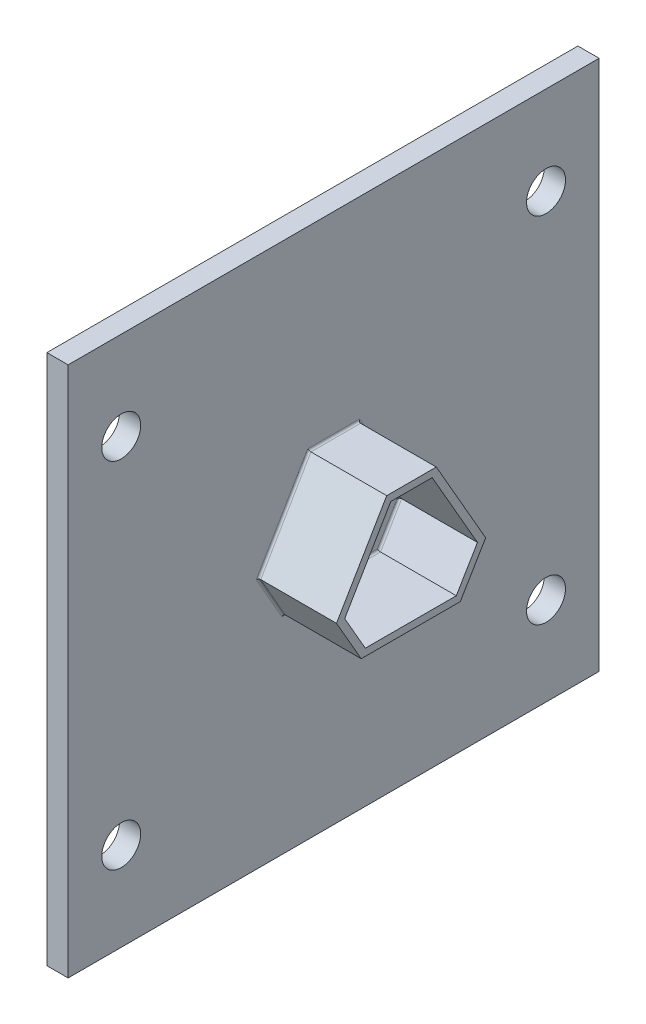
ISO-10303-21;
HEADER;
FILE_DESCRIPTION(('STEP AP214'),'2;1');
FILE_NAME('part.step','',(''),(''),'','','');
FILE_SCHEMA(('AUTOMOTIVE_DESIGN { 1 0 10303 214 1 1 1 1 }'));
ENDSEC;
DATA;
#1=APPLICATION_CONTEXT('core data for automotive mechanical design processes');
#2=APPLICATION_PROTOCOL_DEFINITION('international standard','automotive_design',2000,#1);
#3=PRODUCT_CONTEXT('',#1,'mechanical');
#4=PRODUCT('Part','Part','',(#3));
#5=PRODUCT_RELATED_PRODUCT_CATEGORY('part','',(#4));
#6=PRODUCT_DEFINITION_FORMATION('','',#4);
#7=PRODUCT_DEFINITION_CONTEXT('part definition',#1,'design');
#8=PRODUCT_DEFINITION('design','',#6,#7);
#9=PRODUCT_DEFINITION_SHAPE('','',#8);
#10=(LENGTH_UNIT() NAMED_UNIT(*) SI_UNIT(.MILLI.,.METRE.));
#11=(NAMED_UNIT(*) PLANE_ANGLE_UNIT() SI_UNIT($,.RADIAN.));
#12=(NAMED_UNIT(*) SI_UNIT($,.STERADIAN.) SOLID_ANGLE_UNIT());
#13=UNCERTAINTY_MEASURE_WITH_UNIT(LENGTH_MEASURE(1.E-05),#10,'distance_accuracy_value','');
#14=(GEOMETRIC_REPRESENTATION_CONTEXT(3) GLOBAL_UNCERTAINTY_ASSIGNED_CONTEXT((#13)) GLOBAL_UNIT_ASSIGNED_CONTEXT((#10,
#11,#12)) REPRESENTATION_CONTEXT('',''));
#15=CARTESIAN_POINT('',(0.,0.,0.));
#16=DIRECTION('',(0.,0.,1.));
#17=DIRECTION('',(1.,0.,0.));
#18=AXIS2_PLACEMENT_3D('',#15,#16,#17);
#19=CARTESIAN_POINT('',(3.,0.,0.));
#20=DIRECTION('',(-1.,0.,0.));
#21=DIRECTION('',(0.,0.,1.));
#22=AXIS2_PLACEMENT_3D('',#19,#20,#21);
#23=PLANE('',#22);
#24=DIRECTION('',(0.,-0.00110312181981051,-0.99999939156094));
#25=VECTOR('',#24,1.);
#26=CARTESIAN_POINT('',(3.,136.558370071945,-42.8955674890365));
#27=LINE('',#26,#25);
#28=CARTESIAN_POINT('',(3.,136.542737859647,-57.0664437287992));
#29=VERTEX_POINT('',#28);
#30=CARTESIAN_POINT('',(3.,136.5585613886,-42.7221355659985));
#31=VERTEX_POINT('',#30);
#32=EDGE_CURVE('E322',#29,#31,#27,.F.);
#33=ORIENTED_EDGE('',*,*,#32,.T.);
#34=DIRECTION('',(0.,-0.867141979713052,-0.498061027404604));
#35=VECTOR('',#34,1.);
#36=CARTESIAN_POINT('',(3.,142.778945439183,-39.1493286398363));
#37=LINE('',#36,#35);
#38=CARTESIAN_POINT('',(3.,142.930049924226,-39.0625386367843));
#39=VERTEX_POINT('',#38);
#40=EDGE_CURVE('E332',#31,#39,#37,.F.);
#41=ORIENTED_EDGE('',*,*,#40,.T.);
#42=DIRECTION('',(0.,-0.862259732328274,0.506466340446405));
#43=VECTOR('',#42,1.);
#44=CARTESIAN_POINT('',(3.,155.151939902134,-46.2413220803015));
#45=LINE('',#44,#43);
#46=CARTESIAN_POINT('',(3.,155.3,-46.3282882844751));
#47=VERTEX_POINT('',#46);
#48=EDGE_CURVE('E330',#39,#47,#45,.F.);
#49=ORIENTED_EDGE('',*,*,#48,.T.);
#50=DIRECTION('',(0.,0.,1.));
#51=VECTOR('',#50,1.);
#52=CARTESIAN_POINT('',(3.,155.3,-53.4999999999999));
#53=LINE('',#52,#51);
#54=CARTESIAN_POINT('',(3.,155.3,-53.6736528680441));
#55=VERTEX_POINT('',#54);
#56=EDGE_CURVE('E328',#47,#55,#53,.F.);
#57=ORIENTED_EDGE('',*,*,#56,.T.);
#58=DIRECTION('',(0.,0.867141979713052,0.498061027404604));
#59=VECTOR('',#58,1.);
#60=CARTESIAN_POINT('',(3.,143.009430592239,-60.7329969775783));
#61=LINE('',#60,#59);
#62=CARTESIAN_POINT('',(3.,142.857409670996,-60.8203133548181));
#63=VERTEX_POINT('',#62);
#64=EDGE_CURVE('E326',#55,#63,#61,.F.);
#65=ORIENTED_EDGE('',*,*,#64,.T.);
#66=DIRECTION('',(0.,0.859583728583114,-0.510994925175536));
#67=VECTOR('',#66,1.);
#68=CARTESIAN_POINT('',(3.,136.689627706383,-57.1537650260106));
#69=LINE('',#68,#67);
#70=EDGE_CURVE('E324',#63,#29,#69,.F.);
#71=ORIENTED_EDGE('',*,*,#70,.T.);
#72=EDGE_LOOP('',(#33,#41,#49,#57,#65,#71));
#73=FACE_BOUND('',#72,.T.);
#74=CARTESIAN_POINT('',(3.,120.,-19.9999999999999));
#75=DIRECTION('',(1.,0.,0.));
#76=DIRECTION('',(0.,0.,-1.));
#77=AXIS2_PLACEMENT_3D('',#74,#75,#76);
#78=CIRCLE('',#77,2.75);
#79=CARTESIAN_POINT('',(3.,120.,-22.7499999999999));
#80=VERTEX_POINT('',#79);
#81=EDGE_CURVE('E263',#80,#80,#78,.T.);
#82=ORIENTED_EDGE('',*,*,#81,.F.);
#83=EDGE_LOOP('',(#82));
#84=FACE_BOUND('',#83,.T.);
#85=CARTESIAN_POINT('',(3.,120.,-80.));
#86=DIRECTION('',(1.,0.,0.));
#87=DIRECTION('',(0.,0.,-1.));
#88=AXIS2_PLACEMENT_3D('',#85,#86,#87);
#89=CIRCLE('',#88,2.75000000000001);
#90=CARTESIAN_POINT('',(3.,120.,-82.75));
#91=VERTEX_POINT('',#90);
#92=EDGE_CURVE('E269',#91,#91,#89,.T.);
#93=ORIENTED_EDGE('',*,*,#92,.F.);
#94=EDGE_LOOP('',(#93));
#95=FACE_BOUND('',#94,.T.);
#96=CARTESIAN_POINT('',(3.,170.,-80.));
#97=DIRECTION('',(1.,0.,0.));
#98=DIRECTION('',(0.,0.,-1.));
#99=AXIS2_PLACEMENT_3D('',#96,#97,#98);
#100=CIRCLE('',#99,2.75);
#101=CARTESIAN_POINT('',(3.,170.,-82.75));
#102=VERTEX_POINT('',#101);
#103=EDGE_CURVE('E275',#102,#102,#100,.T.);
#104=ORIENTED_EDGE('',*,*,#103,.F.);
#105=EDGE_LOOP('',(#104));
#106=FACE_BOUND('',#105,.T.);
#107=CARTESIAN_POINT('',(3.,170.,-19.9999999999999));
#108=DIRECTION('',(1.,0.,0.));
#109=DIRECTION('',(0.,0.,-1.));
#110=AXIS2_PLACEMENT_3D('',#107,#108,#109);
#111=CIRCLE('',#110,2.75000000000001);
#112=CARTESIAN_POINT('',(3.,170.,-22.75));
#113=VERTEX_POINT('',#112);
#114=EDGE_CURVE('E281',#113,#113,#111,.T.);
#115=ORIENTED_EDGE('',*,*,#114,.F.);
#116=EDGE_LOOP('',(#115));
#117=FACE_BOUND('',#116,.T.);
#118=DIRECTION('',(0.,1.,0.));
#119=VECTOR('',#118,1.);
#120=CARTESIAN_POINT('',(3.,107.5,-87.4999999999999));
#121=LINE('',#120,#119);
#122=CARTESIAN_POINT('',(3.,107.5,-87.4999999999999));
#123=VERTEX_POINT('',#122);
#124=CARTESIAN_POINT('',(3.,182.5,-87.4999999999999));
#125=VERTEX_POINT('',#124);
#126=EDGE_CURVE('E290',#123,#125,#121,.T.);
#127=ORIENTED_EDGE('',*,*,#126,.T.);
#128=DIRECTION('',(0.,0.,1.));
#129=VECTOR('',#128,1.);
#130=CARTESIAN_POINT('',(3.,182.5,-12.4999999999999));
#131=LINE('',#130,#129);
#132=CARTESIAN_POINT('',(3.,182.5,-12.4999999999999));
#133=VERTEX_POINT('',#132);
#134=EDGE_CURVE('E293',#125,#133,#131,.T.);
#135=ORIENTED_EDGE('',*,*,#134,.T.);
#136=DIRECTION('',(0.,-1.,0.));
#137=VECTOR('',#136,1.);
#138=CARTESIAN_POINT('',(3.,107.5,-12.4999999999999));
#139=LINE('',#138,#137);
#140=CARTESIAN_POINT('',(3.,107.5,-12.4999999999999));
#141=VERTEX_POINT('',#140);
#142=EDGE_CURVE('E296',#133,#141,#139,.T.);
#143=ORIENTED_EDGE('',*,*,#142,.T.);
#144=DIRECTION('',(0.,0.,-1.));
#145=VECTOR('',#144,1.);
#146=CARTESIAN_POINT('',(3.,107.5,-12.4999999999999));
#147=LINE('',#146,#145);
#148=EDGE_CURVE('E298',#141,#123,#147,.T.);
#149=ORIENTED_EDGE('',*,*,#148,.T.);
#150=EDGE_LOOP('',(#127,#135,#143,#149));
#151=FACE_BOUND('',#150,.T.);
#152=ADVANCED_FACE('F36',(#73,#84,#95,#106,#117,#151),#23,.F.);
#153=CARTESIAN_POINT('',(0.,0.,0.));
#154=DIRECTION('',(-1.,0.,0.));
#155=DIRECTION('',(0.,0.,1.));
#156=AXIS2_PLACEMENT_3D('',#153,#154,#155);
#157=PLANE('',#156);
#158=CARTESIAN_POINT('',(0.,120.,-80.));
#159=DIRECTION('',(1.,0.,0.));
#160=DIRECTION('',(0.,0.,-1.));
#161=AXIS2_PLACEMENT_3D('',#158,#159,#160);
#162=CIRCLE('',#161,2.75000000000001);
#163=CARTESIAN_POINT('',(0.,120.,-82.75));
#164=VERTEX_POINT('',#163);
#165=EDGE_CURVE('E266',#164,#164,#162,.T.);
#166=ORIENTED_EDGE('',*,*,#165,.T.);
#167=EDGE_LOOP('',(#166));
#168=FACE_BOUND('',#167,.T.);
#169=CARTESIAN_POINT('',(0.,170.,-19.9999999999999));
#170=DIRECTION('',(1.,0.,0.));
#171=DIRECTION('',(0.,0.,-1.));
#172=AXIS2_PLACEMENT_3D('',#169,#170,#171);
#173=CIRCLE('',#172,2.75000000000001);
#174=CARTESIAN_POINT('',(0.,170.,-22.75));
#175=VERTEX_POINT('',#174);
#176=EDGE_CURVE('E278',#175,#175,#173,.T.);
#177=ORIENTED_EDGE('',*,*,#176,.T.);
#178=EDGE_LOOP('',(#177));
#179=FACE_BOUND('',#178,.T.);
#180=DIRECTION('',(0.,1.,0.));
#181=VECTOR('',#180,1.);
#182=CARTESIAN_POINT('',(0.,107.5,-87.4999999999999));
#183=LINE('',#182,#181);
#184=CARTESIAN_POINT('',(0.,107.5,-87.4999999999999));
#185=VERTEX_POINT('',#184);
#186=CARTESIAN_POINT('',(0.,182.5,-87.4999999999999));
#187=VERTEX_POINT('',#186);
#188=EDGE_CURVE('E289',#185,#187,#183,.T.);
#189=ORIENTED_EDGE('',*,*,#188,.F.);
#190=DIRECTION('',(0.,0.,-1.));
#191=VECTOR('',#190,1.);
#192=CARTESIAN_POINT('',(0.,107.5,-12.4999999999999));
#193=LINE('',#192,#191);
#194=CARTESIAN_POINT('',(0.,107.5,-12.4999999999999));
#195=VERTEX_POINT('',#194);
#196=EDGE_CURVE('E294',#195,#185,#193,.T.);
#197=ORIENTED_EDGE('',*,*,#196,.F.);
#198=DIRECTION('',(0.,-1.,0.));
#199=VECTOR('',#198,1.);
#200=CARTESIAN_POINT('',(0.,107.5,-12.4999999999999));
#201=LINE('',#200,#199);
#202=CARTESIAN_POINT('',(0.,182.5,-12.4999999999999));
#203=VERTEX_POINT('',#202);
#204=EDGE_CURVE('E305',#203,#195,#201,.T.);
#205=ORIENTED_EDGE('',*,*,#204,.F.);
#206=DIRECTION('',(0.,0.,1.));
#207=VECTOR('',#206,1.);
#208=CARTESIAN_POINT('',(0.,182.5,-12.4999999999999));
#209=LINE('',#208,#207);
#210=EDGE_CURVE('E303',#187,#203,#209,.T.);
#211=ORIENTED_EDGE('',*,*,#210,.F.);
#212=EDGE_LOOP('',(#189,#197,#205,#211));
#213=FACE_BOUND('',#212,.T.);
#214=CARTESIAN_POINT('',(0.,145.,-50.));
#215=DIRECTION('',(1.,0.,0.));
#216=DIRECTION('',(0.,0.,-1.));
#217=AXIS2_PLACEMENT_3D('',#214,#215,#216);
#218=CIRCLE('',#217,6.5);
#219=CARTESIAN_POINT('',(0.,145.,-56.5));
#220=VERTEX_POINT('',#219);
#221=EDGE_CURVE('E284',#220,#220,#218,.T.);
#222=ORIENTED_EDGE('',*,*,#221,.T.);
#223=EDGE_LOOP('',(#222));
#224=FACE_BOUND('',#223,.T.);
#225=CARTESIAN_POINT('',(0.,170.,-80.));
#226=DIRECTION('',(1.,0.,0.));
#227=DIRECTION('',(0.,0.,-1.));
#228=AXIS2_PLACEMENT_3D('',#225,#226,#227);
#229=CIRCLE('',#228,2.75);
#230=CARTESIAN_POINT('',(0.,170.,-82.75));
#231=VERTEX_POINT('',#230);
#232=EDGE_CURVE('E272',#231,#231,#229,.T.);
#233=ORIENTED_EDGE('',*,*,#232,.T.);
#234=EDGE_LOOP('',(#233));
#235=FACE_BOUND('',#234,.T.);
#236=CARTESIAN_POINT('',(0.,120.,-19.9999999999999));
#237=DIRECTION('',(1.,0.,0.));
#238=DIRECTION('',(0.,0.,-1.));
#239=AXIS2_PLACEMENT_3D('',#236,#237,#238);
#240=CIRCLE('',#239,2.75);
#241=CARTESIAN_POINT('',(0.,120.,-22.7499999999999));
#242=VERTEX_POINT('',#241);
#243=EDGE_CURVE('E260',#242,#242,#240,.T.);
#244=ORIENTED_EDGE('',*,*,#243,.T.);
#245=EDGE_LOOP('',(#244));
#246=FACE_BOUND('',#245,.T.);
#247=ADVANCED_FACE('F427',(#168,#179,#213,#224,#235,#246),#157,.T.);
#248=CARTESIAN_POINT('',(3.,107.5,-87.4999999999999));
#249=DIRECTION('',(0.,0.,1.));
#250=DIRECTION('',(1.,0.,0.));
#251=AXIS2_PLACEMENT_3D('',#248,#249,#250);
#252=PLANE('',#251);
#253=ORIENTED_EDGE('',*,*,#188,.T.);
#254=DIRECTION('',(-1.,0.,0.));
#255=VECTOR('',#254,1.);
#256=CARTESIAN_POINT('',(3.,182.5,-87.4999999999999));
#257=LINE('',#256,#255);
#258=EDGE_CURVE('E316',#125,#187,#257,.T.);
#259=ORIENTED_EDGE('',*,*,#258,.F.);
#260=ORIENTED_EDGE('',*,*,#126,.F.);
#261=DIRECTION('',(-1.,0.,0.));
#262=VECTOR('',#261,1.);
#263=CARTESIAN_POINT('',(3.,107.5,-87.4999999999999));
#264=LINE('',#263,#262);
#265=EDGE_CURVE('E300',#123,#185,#264,.T.);
#266=ORIENTED_EDGE('',*,*,#265,.T.);
#267=EDGE_LOOP('',(#253,#259,#260,#266));
#268=FACE_BOUND('',#267,.T.);
#269=ADVANCED_FACE('F433',(#268),#252,.F.);
#270=CARTESIAN_POINT('',(3.,182.5,-12.4999999999999));
#271=DIRECTION('',(0.,-1.,0.));
#272=DIRECTION('',(0.,0.,-1.));
#273=AXIS2_PLACEMENT_3D('',#270,#271,#272);
#274=PLANE('',#273);
#275=ORIENTED_EDGE('',*,*,#210,.T.);
#276=DIRECTION('',(-1.,0.,0.));
#277=VECTOR('',#276,1.);
#278=CARTESIAN_POINT('',(3.,182.5,-12.4999999999999));
#279=LINE('',#278,#277);
#280=EDGE_CURVE('E313',#133,#203,#279,.T.);
#281=ORIENTED_EDGE('',*,*,#280,.F.);
#282=ORIENTED_EDGE('',*,*,#134,.F.);
#283=ORIENTED_EDGE('',*,*,#258,.T.);
#284=EDGE_LOOP('',(#275,#281,#282,#283));
#285=FACE_BOUND('',#284,.T.);
#286=ADVANCED_FACE('F448',(#285),#274,.F.);
#287=CARTESIAN_POINT('',(3.,107.5,-12.4999999999999));
#288=DIRECTION('',(0.,0.,-1.));
#289=DIRECTION('',(-1.,0.,0.));
#290=AXIS2_PLACEMENT_3D('',#287,#288,#289);
#291=PLANE('',#290);
#292=ORIENTED_EDGE('',*,*,#204,.T.);
#293=DIRECTION('',(-1.,0.,0.));
#294=VECTOR('',#293,1.);
#295=CARTESIAN_POINT('',(3.,107.5,-12.4999999999999));
#296=LINE('',#295,#294);
#297=EDGE_CURVE('E310',#141,#195,#296,.T.);
#298=ORIENTED_EDGE('',*,*,#297,.F.);
#299=ORIENTED_EDGE('',*,*,#142,.F.);
#300=ORIENTED_EDGE('',*,*,#280,.T.);
#301=EDGE_LOOP('',(#292,#298,#299,#300));
#302=FACE_BOUND('',#301,.T.);
#303=ADVANCED_FACE('F444',(#302),#291,.F.);
#304=CARTESIAN_POINT('',(3.,107.5,-12.4999999999999));
#305=DIRECTION('',(0.,1.,0.));
#306=DIRECTION('',(0.,0.,1.));
#307=AXIS2_PLACEMENT_3D('',#304,#305,#306);
#308=PLANE('',#307);
#309=ORIENTED_EDGE('',*,*,#196,.T.);
#310=ORIENTED_EDGE('',*,*,#265,.F.);
#311=ORIENTED_EDGE('',*,*,#148,.F.);
#312=ORIENTED_EDGE('',*,*,#297,.T.);
#313=EDGE_LOOP('',(#309,#310,#311,#312));
#314=FACE_BOUND('',#313,.T.);
#315=ADVANCED_FACE('F441',(#314),#308,.F.);
#316=CARTESIAN_POINT('',(3.,145.,-50.));
#317=DIRECTION('',(-1.,0.,0.));
#318=DIRECTION('',(0.,0.,1.));
#319=AXIS2_PLACEMENT_3D('',#316,#317,#318);
#320=CYLINDRICAL_SURFACE('',#319,6.5);
#321=CARTESIAN_POINT('',(3.,145.,-50.));
#322=DIRECTION('',(-1.,0.,0.));
#323=DIRECTION('',(0.,0.,1.));
#324=AXIS2_PLACEMENT_3D('',#321,#322,#323);
#325=CIRCLE('',#324,6.5);
#326=CARTESIAN_POINT('',(3.,145.,-43.4999999999999));
#327=VERTEX_POINT('',#326);
#328=EDGE_CURVE('E222',#327,#327,#325,.T.);
#329=ORIENTED_EDGE('',*,*,#328,.F.);
#330=EDGE_LOOP('',(#329));
#331=FACE_BOUND('',#330,.T.);
#332=ORIENTED_EDGE('',*,*,#221,.F.);
#333=EDGE_LOOP('',(#332));
#334=FACE_BOUND('',#333,.T.);
#335=ADVANCED_FACE('F438',(#331,#334),#320,.F.);
#336=CARTESIAN_POINT('',(3.,170.,-19.9999999999999));
#337=DIRECTION('',(-1.,0.,0.));
#338=DIRECTION('',(0.,0.,1.));
#339=AXIS2_PLACEMENT_3D('',#336,#337,#338);
#340=CYLINDRICAL_SURFACE('',#339,2.75000000000001);
#341=ORIENTED_EDGE('',*,*,#114,.T.);
#342=EDGE_LOOP('',(#341));
#343=FACE_BOUND('',#342,.T.);
#344=ORIENTED_EDGE('',*,*,#176,.F.);
#345=EDGE_LOOP('',(#344));
#346=FACE_BOUND('',#345,.T.);
#347=ADVANCED_FACE('F676',(#343,#346),#340,.F.);
#348=CARTESIAN_POINT('',(3.,170.,-80.));
#349=DIRECTION('',(-1.,0.,0.));
#350=DIRECTION('',(0.,0.,1.));
#351=AXIS2_PLACEMENT_3D('',#348,#349,#350);
#352=CYLINDRICAL_SURFACE('',#351,2.75);
#353=ORIENTED_EDGE('',*,*,#103,.T.);
#354=EDGE_LOOP('',(#353));
#355=FACE_BOUND('',#354,.T.);
#356=ORIENTED_EDGE('',*,*,#232,.F.);
#357=EDGE_LOOP('',(#356));
#358=FACE_BOUND('',#357,.T.);
#359=ADVANCED_FACE('F665',(#355,#358),#352,.F.);
#360=CARTESIAN_POINT('',(3.,120.,-80.));
#361=DIRECTION('',(-1.,0.,0.));
#362=DIRECTION('',(0.,0.,1.));
#363=AXIS2_PLACEMENT_3D('',#360,#361,#362);
#364=CYLINDRICAL_SURFACE('',#363,2.75000000000001);
#365=ORIENTED_EDGE('',*,*,#92,.T.);
#366=EDGE_LOOP('',(#365));
#367=FACE_BOUND('',#366,.T.);
#368=ORIENTED_EDGE('',*,*,#165,.F.);
#369=EDGE_LOOP('',(#368));
#370=FACE_BOUND('',#369,.T.);
#371=ADVANCED_FACE('F655',(#367,#370),#364,.F.);
#372=CARTESIAN_POINT('',(3.,120.,-19.9999999999999));
#373=DIRECTION('',(-1.,0.,0.));
#374=DIRECTION('',(0.,0.,1.));
#375=AXIS2_PLACEMENT_3D('',#372,#373,#374);
#376=CYLINDRICAL_SURFACE('',#375,2.75);
#377=ORIENTED_EDGE('',*,*,#81,.T.);
#378=EDGE_LOOP('',(#377));
#379=FACE_BOUND('',#378,.T.);
#380=ORIENTED_EDGE('',*,*,#243,.F.);
#381=EDGE_LOOP('',(#380));
#382=FACE_BOUND('',#381,.T.);
#383=ADVANCED_FACE('F632',(#379,#382),#376,.F.);
#384=CARTESIAN_POINT('',(14.,155.,-53.4999999999999));
#385=DIRECTION('',(0.,-0.498061027404604,0.867141979713052));
#386=DIRECTION('',(0.,-0.867141979713052,-0.498061027404604));
#387=AXIS2_PLACEMENT_3D('',#384,#385,#386);
#388=PLANE('',#387);
#389=DIRECTION('',(-1.,0.,0.));
#390=VECTOR('',#389,1.);
#391=CARTESIAN_POINT('',(14.,142.860012284017,-60.4728543836644));
#392=LINE('',#391,#390);
#393=CARTESIAN_POINT('',(14.,142.860012284017,-60.4728543836644));
#394=VERTEX_POINT('',#393);
#395=CARTESIAN_POINT('',(3.3,142.860012284017,-60.4728543836644));
#396=VERTEX_POINT('',#395);
#397=EDGE_CURVE('E242',#394,#396,#392,.T.);
#398=ORIENTED_EDGE('',*,*,#397,.T.);
#399=DIRECTION('',(0.,0.867141979713052,0.498061027404604));
#400=VECTOR('',#399,1.);
#401=CARTESIAN_POINT('',(3.3,155.,-53.4999999999999));
#402=LINE('',#401,#400);
#403=CARTESIAN_POINT('',(3.3,155.,-53.4999999999999));
#404=VERTEX_POINT('',#403);
#405=EDGE_CURVE('E339',#396,#404,#402,.T.);
#406=ORIENTED_EDGE('',*,*,#405,.T.);
#407=DIRECTION('',(-1.,0.,0.));
#408=VECTOR('',#407,1.);
#409=CARTESIAN_POINT('',(14.,155.,-53.4999999999999));
#410=LINE('',#409,#408);
#411=CARTESIAN_POINT('',(14.,155.,-53.4999999999999));
#412=VERTEX_POINT('',#411);
#413=EDGE_CURVE('E257',#412,#404,#410,.T.);
#414=ORIENTED_EDGE('',*,*,#413,.F.);
#415=DIRECTION('',(0.,0.867141979713052,0.498061027404604));
#416=VECTOR('',#415,1.);
#417=CARTESIAN_POINT('',(14.,155.,-53.4999999999999));
#418=LINE('',#417,#416);
#419=EDGE_CURVE('E229',#394,#412,#418,.T.);
#420=ORIENTED_EDGE('',*,*,#419,.F.);
#421=EDGE_LOOP('',(#398,#406,#414,#420));
#422=FACE_BOUND('',#421,.T.);
#423=ADVANCED_FACE('F622',(#422),#388,.F.);
#424=CARTESIAN_POINT('',(14.,155.,-46.4999999999999));
#425=DIRECTION('',(0.,-1.,0.));
#426=DIRECTION('',(0.,0.,-1.));
#427=AXIS2_PLACEMENT_3D('',#424,#425,#426);
#428=PLANE('',#427);
#429=ORIENTED_EDGE('',*,*,#413,.T.);
#430=DIRECTION('',(0.,0.,1.));
#431=VECTOR('',#430,1.);
#432=CARTESIAN_POINT('',(3.3,155.,-46.4999999999999));
#433=LINE('',#432,#431);
#434=CARTESIAN_POINT('',(3.3,155.,-46.4999999999999));
#435=VERTEX_POINT('',#434);
#436=EDGE_CURVE('E337',#404,#435,#433,.T.);
#437=ORIENTED_EDGE('',*,*,#436,.T.);
#438=DIRECTION('',(-1.,0.,0.));
#439=VECTOR('',#438,1.);
#440=CARTESIAN_POINT('',(14.,155.,-46.4999999999999));
#441=LINE('',#440,#439);
#442=CARTESIAN_POINT('',(14.,155.,-46.4999999999999));
#443=VERTEX_POINT('',#442);
#444=EDGE_CURVE('E254',#443,#435,#441,.T.);
#445=ORIENTED_EDGE('',*,*,#444,.F.);
#446=DIRECTION('',(0.,0.,1.));
#447=VECTOR('',#446,1.);
#448=CARTESIAN_POINT('',(14.,155.,-46.4999999999999));
#449=LINE('',#448,#447);
#450=EDGE_CURVE('E232',#412,#443,#449,.T.);
#451=ORIENTED_EDGE('',*,*,#450,.F.);
#452=EDGE_LOOP('',(#429,#437,#445,#451));
#453=FACE_BOUND('',#452,.T.);
#454=ADVANCED_FACE('F611',(#453),#428,.F.);
#455=CARTESIAN_POINT('',(14.,155.,-46.4999999999999));
#456=DIRECTION('',(0.,-0.506466340446405,-0.862259732328274));
#457=DIRECTION('',(0.,0.862259732328274,-0.506466340446405));
#458=AXIS2_PLACEMENT_3D('',#455,#456,#457);
#459=PLANE('',#458);
#460=ORIENTED_EDGE('',*,*,#444,.T.);
#461=DIRECTION('',(0.,-0.862259732328274,0.506466340446405));
#462=VECTOR('',#461,1.);
#463=CARTESIAN_POINT('',(3.3,142.928363747404,-39.4094712337503));
#464=LINE('',#463,#462);
#465=CARTESIAN_POINT('',(3.3,142.928363747404,-39.4094712337503));
#466=VERTEX_POINT('',#465);
#467=EDGE_CURVE('E335',#435,#466,#464,.T.);
#468=ORIENTED_EDGE('',*,*,#467,.T.);
#469=DIRECTION('',(-1.,0.,0.));
#470=VECTOR('',#469,1.);
#471=CARTESIAN_POINT('',(14.,142.928363747404,-39.4094712337503));
#472=LINE('',#471,#470);
#473=CARTESIAN_POINT('',(14.,142.928363747404,-39.4094712337503));
#474=VERTEX_POINT('',#473);
#475=EDGE_CURVE('E251',#474,#466,#472,.T.);
#476=ORIENTED_EDGE('',*,*,#475,.F.);
#477=DIRECTION('',(0.,-0.862259732328274,0.506466340446405));
#478=VECTOR('',#477,1.);
#479=CARTESIAN_POINT('',(14.,155.,-46.4999999999999));
#480=LINE('',#479,#478);
#481=EDGE_CURVE('E234',#443,#474,#480,.T.);
#482=ORIENTED_EDGE('',*,*,#481,.F.);
#483=EDGE_LOOP('',(#460,#468,#476,#482));
#484=FACE_BOUND('',#483,.T.);
#485=ADVANCED_FACE('F600',(#484),#459,.F.);
#486=CARTESIAN_POINT('',(14.,142.928363747404,-39.4094712337503));
#487=DIRECTION('',(0.,0.498061027404604,-0.867141979713052));
#488=DIRECTION('',(0.,0.867141979713052,0.498061027404604));
#489=AXIS2_PLACEMENT_3D('',#486,#487,#488);
#490=PLANE('',#489);
#491=ORIENTED_EDGE('',*,*,#475,.T.);
#492=DIRECTION('',(0.,-0.867141979713052,-0.498061027404604));
#493=VECTOR('',#492,1.);
#494=CARTESIAN_POINT('',(3.3,136.858369889413,-42.8958984255825));
#495=LINE('',#494,#493);
#496=CARTESIAN_POINT('',(3.3,136.858369889413,-42.8958984255825));
#497=VERTEX_POINT('',#496);
#498=EDGE_CURVE('E319',#466,#497,#495,.T.);
#499=ORIENTED_EDGE('',*,*,#498,.T.);
#500=DIRECTION('',(-1.,0.,0.));
#501=VECTOR('',#500,1.);
#502=CARTESIAN_POINT('',(14.,136.858369889413,-42.8958984255825));
#503=LINE('',#502,#501);
#504=CARTESIAN_POINT('',(14.,136.858369889413,-42.8958984255825));
#505=VERTEX_POINT('',#504);
#506=EDGE_CURVE('E248',#505,#497,#503,.T.);
#507=ORIENTED_EDGE('',*,*,#506,.F.);
#508=DIRECTION('',(0.,-0.867141979713052,-0.498061027404604));
#509=VECTOR('',#508,1.);
#510=CARTESIAN_POINT('',(14.,142.928363747404,-39.4094712337503));
#511=LINE('',#510,#509);
#512=EDGE_CURVE('E236',#474,#505,#511,.T.);
#513=ORIENTED_EDGE('',*,*,#512,.F.);
#514=EDGE_LOOP('',(#491,#499,#507,#513));
#515=FACE_BOUND('',#514,.T.);
#516=ADVANCED_FACE('F589',(#515),#490,.F.);
#517=CARTESIAN_POINT('',(14.,136.858369889413,-42.8958984255825));
#518=DIRECTION('',(0.,0.99999939156094,-0.00110312181981051));
#519=DIRECTION('',(0.,0.00110312181981051,0.99999939156094));
#520=AXIS2_PLACEMENT_3D('',#517,#518,#519);
#521=PLANE('',#520);
#522=ORIENTED_EDGE('',*,*,#506,.T.);
#523=DIRECTION('',(0.,-0.00110312181981051,-0.99999939156094));
#524=VECTOR('',#523,1.);
#525=CARTESIAN_POINT('',(3.3,136.842926183936,-56.8958899074356));
#526=LINE('',#525,#524);
#527=CARTESIAN_POINT('',(3.3,136.842926183936,-56.8958899074356));
#528=VERTEX_POINT('',#527);
#529=EDGE_CURVE('E343',#497,#528,#526,.T.);
#530=ORIENTED_EDGE('',*,*,#529,.T.);
#531=DIRECTION('',(-1.,0.,0.));
#532=VECTOR('',#531,1.);
#533=CARTESIAN_POINT('',(14.,136.842926183936,-56.8958899074356));
#534=LINE('',#533,#532);
#535=CARTESIAN_POINT('',(14.,136.842926183936,-56.8958899074356));
#536=VERTEX_POINT('',#535);
#537=EDGE_CURVE('E245',#536,#528,#534,.T.);
#538=ORIENTED_EDGE('',*,*,#537,.F.);
#539=DIRECTION('',(0.,-0.00110312181981051,-0.99999939156094));
#540=VECTOR('',#539,1.);
#541=CARTESIAN_POINT('',(14.,136.858369889413,-42.8958984255825));
#542=LINE('',#541,#540);
#543=EDGE_CURVE('E238',#505,#536,#542,.T.);
#544=ORIENTED_EDGE('',*,*,#543,.F.);
#545=EDGE_LOOP('',(#522,#530,#538,#544));
#546=FACE_BOUND('',#545,.T.);
#547=ADVANCED_FACE('F578',(#546),#521,.F.);
#548=CARTESIAN_POINT('',(14.,142.860012284017,-60.4728543836644));
#549=DIRECTION('',(0.,0.510994925175536,0.859583728583114));
#550=DIRECTION('',(0.,-0.859583728583114,0.510994925175536));
#551=AXIS2_PLACEMENT_3D('',#548,#549,#550);
#552=PLANE('',#551);
#553=ORIENTED_EDGE('',*,*,#537,.T.);
#554=DIRECTION('',(0.,0.859583728583114,-0.510994925175536));
#555=VECTOR('',#554,1.);
#556=CARTESIAN_POINT('',(3.3,142.860012284017,-60.4728543836644));
#557=LINE('',#556,#555);
#558=EDGE_CURVE('E341',#528,#396,#557,.T.);
#559=ORIENTED_EDGE('',*,*,#558,.T.);
#560=ORIENTED_EDGE('',*,*,#397,.F.);
#561=DIRECTION('',(0.,0.859583728583114,-0.510994925175536));
#562=VECTOR('',#561,1.);
#563=CARTESIAN_POINT('',(14.,142.860012284017,-60.4728543836644));
#564=LINE('',#563,#562);
#565=EDGE_CURVE('E240',#536,#394,#564,.T.);
#566=ORIENTED_EDGE('',*,*,#565,.F.);
#567=EDGE_LOOP('',(#553,#559,#560,#566));
#568=FACE_BOUND('',#567,.T.);
#569=ADVANCED_FACE('F573',(#568),#552,.F.);
#570=CARTESIAN_POINT('',(14.,0.,0.));
#571=DIRECTION('',(-1.,0.,0.));
#572=DIRECTION('',(0.,0.,1.));
#573=AXIS2_PLACEMENT_3D('',#570,#571,#572);
#574=PLANE('',#573);
#575=DIRECTION('',(0.,-0.862259732328274,0.506466340446405));
#576=VECTOR('',#575,1.);
#577=CARTESIAN_POINT('',(14.,154.,-47.0723723850827));
#578=LINE('',#577,#576);
#579=CARTESIAN_POINT('',(14.,154.,-47.0723723850827));
#580=VERTEX_POINT('',#579);
#581=CARTESIAN_POINT('',(14.,142.922743157999,-40.565913223637));
#582=VERTEX_POINT('',#581);
#583=EDGE_CURVE('E198',#580,#582,#578,.T.);
#584=ORIENTED_EDGE('',*,*,#583,.F.);
#585=DIRECTION('',(0.,0.,1.));
#586=VECTOR('',#585,1.);
#587=CARTESIAN_POINT('',(14.,154.,-52.9211571065196));
#588=LINE('',#587,#586);
#589=CARTESIAN_POINT('',(14.,154.,-52.9211571065196));
#590=VERTEX_POINT('',#589);
#591=EDGE_CURVE('E203',#590,#580,#588,.T.);
#592=ORIENTED_EDGE('',*,*,#591,.F.);
#593=DIRECTION('',(0.,0.867141979713051,0.498061027404605));
#594=VECTOR('',#593,1.);
#595=CARTESIAN_POINT('',(14.,142.868687660755,-59.314657813152));
#596=LINE('',#595,#594);
#597=CARTESIAN_POINT('',(14.,142.868687660755,-59.314657813152));
#598=VERTEX_POINT('',#597);
#599=EDGE_CURVE('E217',#598,#590,#596,.T.);
#600=ORIENTED_EDGE('',*,*,#599,.F.);
#601=DIRECTION('',(0.,0.859583728583114,-0.510994925175536));
#602=VECTOR('',#601,1.);
#603=CARTESIAN_POINT('',(14.,137.843553931563,-56.3273771695569));
#604=LINE('',#603,#602);
#605=CARTESIAN_POINT('',(14.,137.843553931563,-56.3273771695569));
#606=VERTEX_POINT('',#605);
#607=EDGE_CURVE('E211',#606,#598,#604,.T.);
#608=ORIENTED_EDGE('',*,*,#607,.F.);
#609=DIRECTION('',(0.,-0.00110312181980976,-0.99999939156094));
#610=VECTOR('',#609,1.);
#611=CARTESIAN_POINT('',(14.,137.857731558791,-43.4751079575292));
#612=LINE('',#611,#610);
#613=CARTESIAN_POINT('',(14.,137.857731558791,-43.4751079575292));
#614=VERTEX_POINT('',#613);
#615=EDGE_CURVE('E209',#614,#606,#612,.T.);
#616=ORIENTED_EDGE('',*,*,#615,.F.);
#617=DIRECTION('',(0.,-0.867141979713051,-0.498061027404605));
#618=VECTOR('',#617,1.);
#619=CARTESIAN_POINT('',(14.,142.922743157999,-40.565913223637));
#620=LINE('',#619,#618);
#621=EDGE_CURVE('E190',#582,#614,#620,.T.);
#622=ORIENTED_EDGE('',*,*,#621,.F.);
#623=EDGE_LOOP('',(#584,#592,#600,#608,#616,#622));
#624=FACE_BOUND('',#623,.T.);
#625=ORIENTED_EDGE('',*,*,#419,.T.);
#626=ORIENTED_EDGE('',*,*,#450,.T.);
#627=ORIENTED_EDGE('',*,*,#481,.T.);
#628=ORIENTED_EDGE('',*,*,#512,.T.);
#629=ORIENTED_EDGE('',*,*,#543,.T.);
#630=ORIENTED_EDGE('',*,*,#565,.T.);
#631=EDGE_LOOP('',(#625,#626,#627,#628,#629,#630));
#632=FACE_BOUND('',#631,.T.);
#633=ADVANCED_FACE('F205',(#624,#632),#574,.F.);
#634=CARTESIAN_POINT('',(3.,0.,0.));
#635=DIRECTION('',(1.,0.,0.));
#636=DIRECTION('',(0.,0.,-1.));
#637=AXIS2_PLACEMENT_3D('',#634,#635,#636);
#638=PLANE('',#637);
#639=DIRECTION('',(0.,-0.862259732328274,0.506466340446405));
#640=VECTOR('',#639,1.);
#641=CARTESIAN_POINT('',(3.,18.7935504299049,31.9960488369365));
#642=LINE('',#641,#640);
#643=CARTESIAN_POINT('',(3.,153.7,-47.2440841006076));
#644=VERTEX_POINT('',#643);
#645=CARTESIAN_POINT('',(3.,142.921056981178,-40.912845820603));
#646=VERTEX_POINT('',#645);
#647=EDGE_CURVE('E345',#644,#646,#642,.T.);
#648=ORIENTED_EDGE('',*,*,#647,.T.);
#649=DIRECTION('',(0.,-0.867141979713051,-0.498061027404605));
#650=VECTOR('',#649,1.);
#651=CARTESIAN_POINT('',(3.,53.1235152129118,-92.4899311859204));
#652=LINE('',#651,#650);
#653=CARTESIAN_POINT('',(3.,138.157540059604,-43.6488708171132));
#654=VERTEX_POINT('',#653);
#655=EDGE_CURVE('E355',#646,#654,#652,.T.);
#656=ORIENTED_EDGE('',*,*,#655,.T.);
#657=DIRECTION('',(0.,-0.00110312181980976,-0.99999939156094));
#658=VECTOR('',#657,1.);
#659=CARTESIAN_POINT('',(3.,138.20552193128,-0.152457619621761));
#660=LINE('',#659,#658);
#661=CARTESIAN_POINT('',(3.,138.143742255851,-56.1568233481933));
#662=VERTEX_POINT('',#661);
#663=EDGE_CURVE('E353',#654,#662,#660,.T.);
#664=ORIENTED_EDGE('',*,*,#663,.T.);
#665=DIRECTION('',(0.,0.859583728583114,-0.510994925175536));
#666=VECTOR('',#665,1.);
#667=CARTESIAN_POINT('',(3.,11.4050284089352,19.1852724192538));
#668=LINE('',#667,#666);
#669=CARTESIAN_POINT('',(3.,142.871290273776,-58.9671988419983));
#670=VERTEX_POINT('',#669);
#671=EDGE_CURVE('E351',#662,#670,#668,.T.);
#672=ORIENTED_EDGE('',*,*,#671,.T.);
#673=DIRECTION('',(0.,0.867141979713051,0.498061027404605));
#674=VECTOR('',#673,1.);
#675=CARTESIAN_POINT('',(3.,60.9086576070728,-106.044141245678));
#676=LINE('',#675,#674);
#677=CARTESIAN_POINT('',(3.,153.7,-52.7475042384755));
#678=VERTEX_POINT('',#677);
#679=EDGE_CURVE('E349',#670,#678,#676,.T.);
#680=ORIENTED_EDGE('',*,*,#679,.T.);
#681=DIRECTION('',(0.,0.,1.));
#682=VECTOR('',#681,1.);
#683=CARTESIAN_POINT('',(3.,153.7,0.));
#684=LINE('',#683,#682);
#685=EDGE_CURVE('E347',#678,#644,#684,.T.);
#686=ORIENTED_EDGE('',*,*,#685,.T.);
#687=EDGE_LOOP('',(#648,#656,#664,#672,#680,#686));
#688=FACE_BOUND('',#687,.T.);
#689=ORIENTED_EDGE('',*,*,#328,.T.);
#690=EDGE_LOOP('',(#689));
#691=FACE_BOUND('',#690,.T.);
#692=ADVANCED_FACE('F415',(#688,#691),#638,.T.);
#693=CARTESIAN_POINT('',(3.,154.,-52.9211571065196));
#694=DIRECTION('',(0.,1.,0.));
#695=DIRECTION('',(0.,0.,1.));
#696=AXIS2_PLACEMENT_3D('',#693,#694,#695);
#697=PLANE('',#696);
#698=DIRECTION('',(1.,0.,0.));
#699=VECTOR('',#698,1.);
#700=CARTESIAN_POINT('',(3.,154.,-47.0723723850827));
#701=LINE('',#700,#699);
#702=CARTESIAN_POINT('',(3.3,154.,-47.0723723850827));
#703=VERTEX_POINT('',#702);
#704=EDGE_CURVE('E195',#703,#580,#701,.T.);
#705=ORIENTED_EDGE('',*,*,#704,.F.);
#706=DIRECTION('',(0.,0.,1.));
#707=VECTOR('',#706,1.);
#708=CARTESIAN_POINT('',(3.3,154.,-52.9211571065196));
#709=LINE('',#708,#707);
#710=CARTESIAN_POINT('',(3.3,154.,-52.9211571065196));
#711=VERTEX_POINT('',#710);
#712=EDGE_CURVE('E45',#703,#711,#709,.F.);
#713=ORIENTED_EDGE('',*,*,#712,.T.);
#714=DIRECTION('',(1.,0.,0.));
#715=VECTOR('',#714,1.);
#716=CARTESIAN_POINT('',(3.,154.,-52.9211571065196));
#717=LINE('',#716,#715);
#718=EDGE_CURVE('E220',#711,#590,#717,.T.);
#719=ORIENTED_EDGE('',*,*,#718,.T.);
#720=ORIENTED_EDGE('',*,*,#591,.T.);
#721=EDGE_LOOP('',(#705,#713,#719,#720));
#722=FACE_BOUND('',#721,.T.);
#723=ADVANCED_FACE('F413',(#722),#697,.F.);
#724=CARTESIAN_POINT('',(3.,142.868687660755,-59.314657813152));
#725=DIRECTION('',(0.,0.498061027404605,-0.867141979713051));
#726=DIRECTION('',(0.,0.867141979713051,0.498061027404605));
#727=AXIS2_PLACEMENT_3D('',#724,#725,#726);
#728=PLANE('',#727);
#729=ORIENTED_EDGE('',*,*,#718,.F.);
#730=DIRECTION('',(0.,0.867141979713051,0.498061027404605));
#731=VECTOR('',#730,1.);
#732=CARTESIAN_POINT('',(3.3,142.868687660755,-59.314657813152));
#733=LINE('',#732,#731);
#734=CARTESIAN_POINT('',(3.3,142.868687660755,-59.314657813152));
#735=VERTEX_POINT('',#734);
#736=EDGE_CURVE('E363',#711,#735,#733,.F.);
#737=ORIENTED_EDGE('',*,*,#736,.T.);
#738=DIRECTION('',(1.,0.,0.));
#739=VECTOR('',#738,1.);
#740=CARTESIAN_POINT('',(3.,142.868687660755,-59.314657813152));
#741=LINE('',#740,#739);
#742=EDGE_CURVE('E223',#735,#598,#741,.T.);
#743=ORIENTED_EDGE('',*,*,#742,.T.);
#744=ORIENTED_EDGE('',*,*,#599,.T.);
#745=EDGE_LOOP('',(#729,#737,#743,#744));
#746=FACE_BOUND('',#745,.T.);
#747=ADVANCED_FACE('F408',(#746),#728,.F.);
#748=CARTESIAN_POINT('',(3.,137.843553931563,-56.3273771695569));
#749=DIRECTION('',(0.,-0.510994925175536,-0.859583728583114));
#750=DIRECTION('',(0.,0.859583728583114,-0.510994925175536));
#751=AXIS2_PLACEMENT_3D('',#748,#749,#750);
#752=PLANE('',#751);
#753=ORIENTED_EDGE('',*,*,#742,.F.);
#754=DIRECTION('',(0.,0.859583728583114,-0.510994925175536));
#755=VECTOR('',#754,1.);
#756=CARTESIAN_POINT('',(3.3,137.843553931563,-56.3273771695569));
#757=LINE('',#756,#755);
#758=CARTESIAN_POINT('',(3.3,137.843553931563,-56.3273771695569));
#759=VERTEX_POINT('',#758);
#760=EDGE_CURVE('E361',#735,#759,#757,.F.);
#761=ORIENTED_EDGE('',*,*,#760,.T.);
#762=DIRECTION('',(1.,0.,0.));
#763=VECTOR('',#762,1.);
#764=CARTESIAN_POINT('',(3.,137.843553931563,-56.3273771695569));
#765=LINE('',#764,#763);
#766=EDGE_CURVE('E225',#759,#606,#765,.T.);
#767=ORIENTED_EDGE('',*,*,#766,.T.);
#768=ORIENTED_EDGE('',*,*,#607,.T.);
#769=EDGE_LOOP('',(#753,#761,#767,#768));
#770=FACE_BOUND('',#769,.T.);
#771=ADVANCED_FACE('F410',(#770),#752,.F.);
#772=CARTESIAN_POINT('',(3.,137.857731558791,-43.4751079575292));
#773=DIRECTION('',(0.,-0.99999939156094,0.00110312181980976));
#774=DIRECTION('',(0.,-0.00110312181980976,-0.99999939156094));
#775=AXIS2_PLACEMENT_3D('',#772,#773,#774);
#776=PLANE('',#775);
#777=ORIENTED_EDGE('',*,*,#766,.F.);
#778=DIRECTION('',(0.,-0.00110312181980976,-0.99999939156094));
#779=VECTOR('',#778,1.);
#780=CARTESIAN_POINT('',(3.3,137.857731558791,-43.4751079575292));
#781=LINE('',#780,#779);
#782=CARTESIAN_POINT('',(3.3,137.857731558791,-43.4751079575292));
#783=VERTEX_POINT('',#782);
#784=EDGE_CURVE('E359',#759,#783,#781,.F.);
#785=ORIENTED_EDGE('',*,*,#784,.T.);
#786=DIRECTION('',(1.,0.,0.));
#787=VECTOR('',#786,1.);
#788=CARTESIAN_POINT('',(3.,137.857731558791,-43.4751079575292));
#789=LINE('',#788,#787);
#790=EDGE_CURVE('E194',#783,#614,#789,.T.);
#791=ORIENTED_EDGE('',*,*,#790,.T.);
#792=ORIENTED_EDGE('',*,*,#615,.T.);
#793=EDGE_LOOP('',(#777,#785,#791,#792));
#794=FACE_BOUND('',#793,.T.);
#795=ADVANCED_FACE('F535',(#794),#776,.F.);
#796=CARTESIAN_POINT('',(3.,142.922743157999,-40.565913223637));
#797=DIRECTION('',(0.,-0.498061027404605,0.867141979713051));
#798=DIRECTION('',(0.,-0.867141979713051,-0.498061027404605));
#799=AXIS2_PLACEMENT_3D('',#796,#797,#798);
#800=PLANE('',#799);
#801=ORIENTED_EDGE('',*,*,#790,.F.);
#802=DIRECTION('',(0.,-0.867141979713051,-0.498061027404605));
#803=VECTOR('',#802,1.);
#804=CARTESIAN_POINT('',(3.3,142.922743157999,-40.565913223637));
#805=LINE('',#804,#803);
#806=CARTESIAN_POINT('',(3.3,142.922743157999,-40.565913223637));
#807=VERTEX_POINT('',#806);
#808=EDGE_CURVE('E193',#783,#807,#805,.F.);
#809=ORIENTED_EDGE('',*,*,#808,.T.);
#810=DIRECTION('',(1.,0.,0.));
#811=VECTOR('',#810,1.);
#812=CARTESIAN_POINT('',(3.,142.922743157999,-40.565913223637));
#813=LINE('',#812,#811);
#814=EDGE_CURVE('E185',#807,#582,#813,.T.);
#815=ORIENTED_EDGE('',*,*,#814,.T.);
#816=ORIENTED_EDGE('',*,*,#621,.T.);
#817=EDGE_LOOP('',(#801,#809,#815,#816));
#818=FACE_BOUND('',#817,.T.);
#819=ADVANCED_FACE('F188',(#818),#800,.F.);
#820=CARTESIAN_POINT('',(3.,154.,-47.0723723850827));
#821=DIRECTION('',(0.,0.506466340446405,0.862259732328274));
#822=DIRECTION('',(0.,-0.862259732328274,0.506466340446405));
#823=AXIS2_PLACEMENT_3D('',#820,#821,#822);
#824=PLANE('',#823);
#825=ORIENTED_EDGE('',*,*,#814,.F.);
#826=DIRECTION('',(0.,-0.862259732328274,0.506466340446405));
#827=VECTOR('',#826,1.);
#828=CARTESIAN_POINT('',(3.3,154.,-47.0723723850827));
#829=LINE('',#828,#827);
#830=EDGE_CURVE('E11',#807,#703,#829,.F.);
#831=ORIENTED_EDGE('',*,*,#830,.T.);
#832=ORIENTED_EDGE('',*,*,#704,.T.);
#833=ORIENTED_EDGE('',*,*,#583,.T.);
#834=EDGE_LOOP('',(#825,#831,#832,#833));
#835=FACE_BOUND('',#834,.T.);
#836=ADVANCED_FACE('F199',(#835),#824,.F.);
#837=CARTESIAN_POINT('',(3.3,155.149418308221,-53.7601425939139));
#838=DIRECTION('',(0.,-0.867141979713052,-0.498061027404604));
#839=DIRECTION('',(0.,0.498061027404604,-0.867141979713052));
#840=AXIS2_PLACEMENT_3D('',#837,#838,#839);
#841=CYLINDRICAL_SURFACE('',#840,0.3);
#842=CARTESIAN_POINT('',(3.3,142.857409670996,-60.8203133548181));
#843=DIRECTION('',(0.,-0.999971947997581,0.00749020813616237));
#844=DIRECTION('',(0.,0.00749020813616246,0.999971947997581));
#845=AXIS2_PLACEMENT_3D('',#842,#843,#844);
#846=ELLIPSE('',#845,0.347468718347037,0.3);
#847=EDGE_CURVE('E376',#63,#396,#846,.F.);
#848=ORIENTED_EDGE('',*,*,#847,.F.);
#849=ORIENTED_EDGE('',*,*,#64,.F.);
#850=CARTESIAN_POINT('',(3.3,155.3,-53.6736528680441));
#851=DIRECTION('',(0.,-0.500968548212059,-0.865465489607934));
#852=DIRECTION('',(0.,-0.865465489607935,0.500968548212059));
#853=AXIS2_PLACEMENT_3D('',#850,#851,#852);
#854=ELLIPSE('',#853,0.346634272079298,0.3);
#855=EDGE_CURVE('E379',#404,#55,#854,.T.);
#856=ORIENTED_EDGE('',*,*,#855,.F.);
#857=ORIENTED_EDGE('',*,*,#405,.F.);
#858=EDGE_LOOP('',(#848,#849,#856,#857));
#859=FACE_BOUND('',#858,.T.);
#860=ADVANCED_FACE('F475',(#859),#841,.F.);
#861=CARTESIAN_POINT('',(3.3,155.3,-46.4999999999999));
#862=DIRECTION('',(0.,0.,-1.));
#863=DIRECTION('',(-1.,0.,0.));
#864=AXIS2_PLACEMENT_3D('',#861,#862,#863);
#865=CYLINDRICAL_SURFACE('',#864,0.3);
#866=ORIENTED_EDGE('',*,*,#855,.T.);
#867=ORIENTED_EDGE('',*,*,#56,.F.);
#868=CARTESIAN_POINT('',(3.3,155.3,-46.3282882844751));
#869=DIRECTION('',(0.,0.496756308240567,-0.867890068051941));
#870=DIRECTION('',(0.,-0.867890068051941,-0.496756308240567));
#871=AXIS2_PLACEMENT_3D('',#868,#869,#870);
#872=ELLIPSE('',#871,0.345665898301357,0.3);
#873=EDGE_CURVE('E373',#435,#47,#872,.T.);
#874=ORIENTED_EDGE('',*,*,#873,.F.);
#875=ORIENTED_EDGE('',*,*,#436,.F.);
#876=EDGE_LOOP('',(#866,#867,#874,#875));
#877=FACE_BOUND('',#876,.T.);
#878=ADVANCED_FACE('F471',(#877),#865,.F.);
#879=CARTESIAN_POINT('',(3.3,142.706713806465,-60.7307295022393));
#880=DIRECTION('',(0.,-0.859583728583114,0.510994925175536));
#881=DIRECTION('',(0.,-0.510994925175536,-0.859583728583114));
#882=AXIS2_PLACEMENT_3D('',#879,#880,#881);
#883=CYLINDRICAL_SURFACE('',#882,0.3);
#884=ORIENTED_EDGE('',*,*,#847,.T.);
#885=ORIENTED_EDGE('',*,*,#558,.F.);
#886=CARTESIAN_POINT('',(3.3,136.542737859647,-57.0664437287992));
#887=DIRECTION('',(0.,-0.49399248990586,0.869466169506674));
#888=DIRECTION('',(0.,0.869466169506674,0.49399248990586));
#889=AXIS2_PLACEMENT_3D('',#886,#887,#888);
#890=ELLIPSE('',#889,0.345255899327772,0.3);
#891=EDGE_CURVE('E370',#29,#528,#890,.F.);
#892=ORIENTED_EDGE('',*,*,#891,.F.);
#893=ORIENTED_EDGE('',*,*,#70,.F.);
#894=EDGE_LOOP('',(#884,#885,#892,#893));
#895=FACE_BOUND('',#894,.T.);
#896=ADVANCED_FACE('F467',(#895),#883,.F.);
#897=CARTESIAN_POINT('',(3.3,155.151939902134,-46.2413220803014));
#898=DIRECTION('',(0.,0.862259732328274,-0.506466340446405));
#899=DIRECTION('',(0.,0.506466340446405,0.862259732328274));
#900=AXIS2_PLACEMENT_3D('',#897,#898,#899);
#901=CYLINDRICAL_SURFACE('',#900,0.3);
#902=ORIENTED_EDGE('',*,*,#873,.T.);
#903=ORIENTED_EDGE('',*,*,#48,.F.);
#904=CARTESIAN_POINT('',(3.3,142.930049924226,-39.0625386367842));
#905=DIRECTION('',(0.,0.999988189226896,-0.00486018587239337));
#906=DIRECTION('',(0.,-0.00486018587239346,-0.999988189226896));
#907=AXIS2_PLACEMENT_3D('',#904,#905,#906);
#908=ELLIPSE('',#907,0.346936694556597,0.3);
#909=EDGE_CURVE('E368',#466,#39,#908,.T.);
#910=ORIENTED_EDGE('',*,*,#909,.F.);
#911=ORIENTED_EDGE('',*,*,#467,.F.);
#912=EDGE_LOOP('',(#902,#903,#910,#911));
#913=FACE_BOUND('',#912,.T.);
#914=ADVANCED_FACE('F463',(#913),#901,.F.);
#915=CARTESIAN_POINT('',(3.3,136.558370071945,-42.8955674890365));
#916=DIRECTION('',(0.,0.00110312181981051,0.99999939156094));
#917=DIRECTION('',(0.,-0.99999939156094,0.00110312181981051));
#918=AXIS2_PLACEMENT_3D('',#915,#916,#917);
#919=CYLINDRICAL_SURFACE('',#918,0.3);
#920=ORIENTED_EDGE('',*,*,#891,.T.);
#921=ORIENTED_EDGE('',*,*,#529,.F.);
#922=CARTESIAN_POINT('',(3.3,136.5585613886,-42.7221355659985));
#923=DIRECTION('',(0.,0.501445829015396,0.865189043251857));
#924=DIRECTION('',(0.,-0.865189043251857,0.501445829015395));
#925=AXIS2_PLACEMENT_3D('',#922,#923,#924);
#926=ELLIPSE('',#925,0.346523691153643,0.3);
#927=EDGE_CURVE('E366',#31,#497,#926,.F.);
#928=ORIENTED_EDGE('',*,*,#927,.F.);
#929=ORIENTED_EDGE('',*,*,#32,.F.);
#930=EDGE_LOOP('',(#920,#921,#928,#929));
#931=FACE_BOUND('',#930,.T.);
#932=ADVANCED_FACE('F459',(#931),#919,.F.);
#933=CARTESIAN_POINT('',(3.3,142.778945439183,-39.1493286398363));
#934=DIRECTION('',(0.,0.867141979713052,0.498061027404604));
#935=DIRECTION('',(0.,-0.498061027404604,0.867141979713052));
#936=AXIS2_PLACEMENT_3D('',#933,#934,#935);
#937=CYLINDRICAL_SURFACE('',#936,0.3);
#938=ORIENTED_EDGE('',*,*,#909,.T.);
#939=ORIENTED_EDGE('',*,*,#40,.F.);
#940=ORIENTED_EDGE('',*,*,#927,.T.);
#941=ORIENTED_EDGE('',*,*,#498,.F.);
#942=EDGE_LOOP('',(#938,#939,#940,#941));
#943=FACE_BOUND('',#942,.T.);
#944=ADVANCED_FACE('F456',(#943),#937,.F.);
#945=CARTESIAN_POINT('',(3.3,60.9086576070728,-106.044141245678));
#946=DIRECTION('',(0.,0.867141979713051,0.498061027404605));
#947=DIRECTION('',(0.,-0.498061027404605,0.867141979713051));
#948=AXIS2_PLACEMENT_3D('',#945,#946,#947);
#949=CYLINDRICAL_SURFACE('',#948,0.3);
#950=CARTESIAN_POINT('',(3.3,142.871290273776,-58.9671988419983));
#951=DIRECTION('',(0.,0.999971947997581,-0.00749020813616205));
#952=DIRECTION('',(0.,-0.00749020813616202,-0.999971947997581));
#953=AXIS2_PLACEMENT_3D('',#950,#951,#952);
#954=ELLIPSE('',#953,0.347468718347037,0.3);
#955=EDGE_CURVE('E391',#735,#670,#954,.T.);
#956=ORIENTED_EDGE('',*,*,#955,.F.);
#957=ORIENTED_EDGE('',*,*,#736,.F.);
#958=CARTESIAN_POINT('',(3.3,153.7,-52.7475042384755));
#959=DIRECTION('',(0.,0.500968548212059,0.865465489607935));
#960=DIRECTION('',(0.,0.865465489607935,-0.500968548212059));
#961=AXIS2_PLACEMENT_3D('',#958,#959,#960);
#962=ELLIPSE('',#961,0.346634272079298,0.3);
#963=EDGE_CURVE('E40',#678,#711,#962,.F.);
#964=ORIENTED_EDGE('',*,*,#963,.F.);
#965=ORIENTED_EDGE('',*,*,#679,.F.);
#966=EDGE_LOOP('',(#956,#957,#964,#965));
#967=FACE_BOUND('',#966,.T.);
#968=ADVANCED_FACE('F38',(#967),#949,.F.);
#969=CARTESIAN_POINT('',(3.3,153.7,0.));
#970=DIRECTION('',(0.,0.,1.));
#971=DIRECTION('',(1.,0.,0.));
#972=AXIS2_PLACEMENT_3D('',#969,#970,#971);
#973=CYLINDRICAL_SURFACE('',#972,0.3);
#974=ORIENTED_EDGE('',*,*,#963,.T.);
#975=ORIENTED_EDGE('',*,*,#712,.F.);
#976=CARTESIAN_POINT('',(3.3,153.7,-47.2440841006076));
#977=DIRECTION('',(0.,-0.496756308240567,0.867890068051941));
#978=DIRECTION('',(0.,0.867890068051941,0.496756308240567));
#979=AXIS2_PLACEMENT_3D('',#976,#977,#978);
#980=ELLIPSE('',#979,0.345665898301357,0.3);
#981=EDGE_CURVE('E389',#644,#703,#980,.F.);
#982=ORIENTED_EDGE('',*,*,#981,.F.);
#983=ORIENTED_EDGE('',*,*,#685,.F.);
#984=EDGE_LOOP('',(#974,#975,#982,#983));
#985=FACE_BOUND('',#984,.T.);
#986=ADVANCED_FACE('F401',(#985),#973,.F.);
#987=CARTESIAN_POINT('',(3.3,11.4050284089352,19.1852724192538));
#988=DIRECTION('',(0.,0.859583728583114,-0.510994925175536));
#989=DIRECTION('',(0.,0.510994925175536,0.859583728583114));
#990=AXIS2_PLACEMENT_3D('',#987,#988,#989);
#991=CYLINDRICAL_SURFACE('',#990,0.3);
#992=ORIENTED_EDGE('',*,*,#955,.T.);
#993=ORIENTED_EDGE('',*,*,#671,.F.);
#994=CARTESIAN_POINT('',(3.3,138.143742255851,-56.1568233481933));
#995=DIRECTION('',(0.,0.49399248990586,-0.869466169506674));
#996=DIRECTION('',(0.,-0.869466169506674,-0.49399248990586));
#997=AXIS2_PLACEMENT_3D('',#994,#995,#996);
#998=ELLIPSE('',#997,0.345255899327772,0.3);
#999=EDGE_CURVE('E386',#759,#662,#998,.T.);
#1000=ORIENTED_EDGE('',*,*,#999,.F.);
#1001=ORIENTED_EDGE('',*,*,#760,.F.);
#1002=EDGE_LOOP('',(#992,#993,#1000,#1001));
#1003=FACE_BOUND('',#1002,.T.);
#1004=ADVANCED_FACE('F491',(#1003),#991,.F.);
#1005=CARTESIAN_POINT('',(3.3,18.7935504299049,31.9960488369365));
#1006=DIRECTION('',(0.,-0.862259732328274,0.506466340446405));
#1007=DIRECTION('',(0.,-0.506466340446405,-0.862259732328274));
#1008=AXIS2_PLACEMENT_3D('',#1005,#1006,#1007);
#1009=CYLINDRICAL_SURFACE('',#1008,0.3);
#1010=ORIENTED_EDGE('',*,*,#981,.T.);
#1011=ORIENTED_EDGE('',*,*,#830,.F.);
#1012=CARTESIAN_POINT('',(3.3,142.921056981178,-40.912845820603));
#1013=DIRECTION('',(0.,-0.999988189226896,0.00486018587239279));
#1014=DIRECTION('',(0.,-0.00486018587239279,-0.999988189226896));
#1015=AXIS2_PLACEMENT_3D('',#1012,#1013,#1014);
#1016=ELLIPSE('',#1015,0.346936694556597,0.3);
#1017=EDGE_CURVE('E384',#646,#807,#1016,.F.);
#1018=ORIENTED_EDGE('',*,*,#1017,.F.);
#1019=ORIENTED_EDGE('',*,*,#647,.F.);
#1020=EDGE_LOOP('',(#1010,#1011,#1018,#1019));
#1021=FACE_BOUND('',#1020,.T.);
#1022=ADVANCED_FACE('F487',(#1021),#1009,.F.);
#1023=CARTESIAN_POINT('',(3.3,138.20552193128,-0.152457619621761));
#1024=DIRECTION('',(0.,-0.00110312181980976,-0.99999939156094));
#1025=DIRECTION('',(0.,0.99999939156094,-0.00110312181980976));
#1026=AXIS2_PLACEMENT_3D('',#1023,#1024,#1025);
#1027=CYLINDRICAL_SURFACE('',#1026,0.3);
#1028=ORIENTED_EDGE('',*,*,#999,.T.);
#1029=ORIENTED_EDGE('',*,*,#663,.F.);
#1030=CARTESIAN_POINT('',(3.3,138.157540059604,-43.6488708171132));
#1031=DIRECTION('',(0.,-0.501445829015395,-0.865189043251857));
#1032=DIRECTION('',(0.,-0.865189043251857,0.501445829015395));
#1033=AXIS2_PLACEMENT_3D('',#1030,#1031,#1032);
#1034=ELLIPSE('',#1033,0.346523691153643,0.3);
#1035=EDGE_CURVE('E382',#783,#654,#1034,.T.);
#1036=ORIENTED_EDGE('',*,*,#1035,.F.);
#1037=ORIENTED_EDGE('',*,*,#784,.F.);
#1038=EDGE_LOOP('',(#1028,#1029,#1036,#1037));
#1039=FACE_BOUND('',#1038,.T.);
#1040=ADVANCED_FACE('F483',(#1039),#1027,.F.);
#1041=CARTESIAN_POINT('',(3.3,53.1235152129118,-92.4899311859204));
#1042=DIRECTION('',(0.,-0.867141979713051,-0.498061027404605));
#1043=DIRECTION('',(0.,0.498061027404605,-0.867141979713051));
#1044=AXIS2_PLACEMENT_3D('',#1041,#1042,#1043);
#1045=CYLINDRICAL_SURFACE('',#1044,0.3);
#1046=ORIENTED_EDGE('',*,*,#1017,.T.);
#1047=ORIENTED_EDGE('',*,*,#808,.F.);
#1048=ORIENTED_EDGE('',*,*,#1035,.T.);
#1049=ORIENTED_EDGE('',*,*,#655,.F.);
#1050=EDGE_LOOP('',(#1046,#1047,#1048,#1049));
#1051=FACE_BOUND('',#1050,.T.);
#1052=ADVANCED_FACE('F480',(#1051),#1045,.F.);
#1053=CLOSED_SHELL('',(#152,#247,#269,#286,#303,#315,#335,#347,#359,#371,#383,#423,#454,#485,
#516,#547,#569,#633,#692,#723,#747,#771,#795,#819,#836,#860,#878,#896,#914,#932,#944,#968,#986,
#1004,#1022,#1040,#1052));
#1054=MANIFOLD_SOLID_BREP('B2',#1053);
#1055=ADVANCED_BREP_SHAPE_REPRESENTATION('',(#18,#1054),#14);
#1056=SHAPE_DEFINITION_REPRESENTATION(#9,#1055);
ENDSEC;
END-ISO-10303-21;
